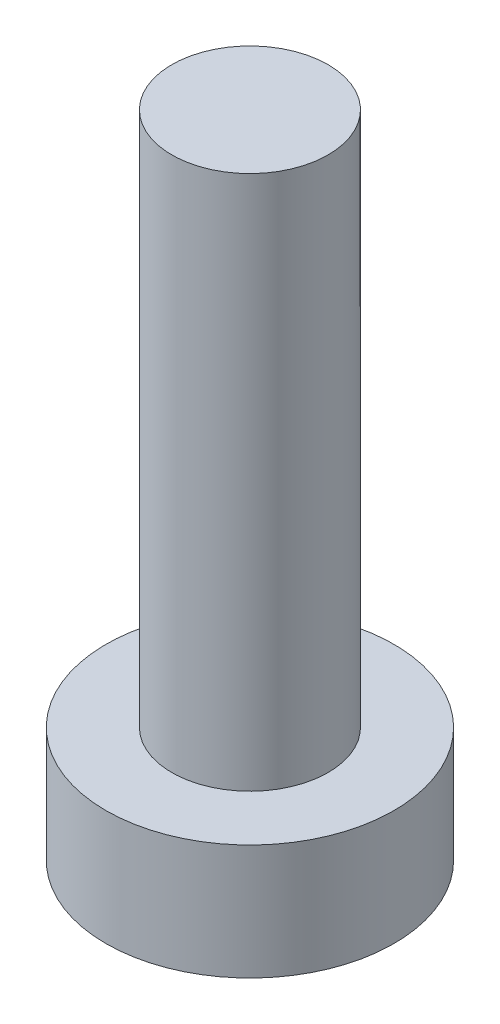
ISO-10303-21;
HEADER;
FILE_DESCRIPTION(('STEP AP214'),'2;1');
FILE_NAME('part.step','',(''),(''),'','','');
FILE_SCHEMA(('AUTOMOTIVE_DESIGN { 1 0 10303 214 1 1 1 1 }'));
ENDSEC;
DATA;
#1=APPLICATION_CONTEXT('core data for automotive mechanical design processes');
#2=APPLICATION_PROTOCOL_DEFINITION('international standard','automotive_design',2000,#1);
#3=PRODUCT_CONTEXT('',#1,'mechanical');
#4=PRODUCT('Part','Part','',(#3));
#5=PRODUCT_RELATED_PRODUCT_CATEGORY('part','',(#4));
#6=PRODUCT_DEFINITION_FORMATION('','',#4);
#7=PRODUCT_DEFINITION_CONTEXT('part definition',#1,'design');
#8=PRODUCT_DEFINITION('design','',#6,#7);
#9=PRODUCT_DEFINITION_SHAPE('','',#8);
#10=(LENGTH_UNIT() NAMED_UNIT(*) SI_UNIT(.MILLI.,.METRE.));
#11=(NAMED_UNIT(*) PLANE_ANGLE_UNIT() SI_UNIT($,.RADIAN.));
#12=(NAMED_UNIT(*) SI_UNIT($,.STERADIAN.) SOLID_ANGLE_UNIT());
#13=UNCERTAINTY_MEASURE_WITH_UNIT(LENGTH_MEASURE(1.E-05),#10,'distance_accuracy_value','');
#14=(GEOMETRIC_REPRESENTATION_CONTEXT(3) GLOBAL_UNCERTAINTY_ASSIGNED_CONTEXT((#13)) GLOBAL_UNIT_ASSIGNED_CONTEXT((#10,
#11,#12)) REPRESENTATION_CONTEXT('',''));
#15=CARTESIAN_POINT('',(0.,0.,0.));
#16=DIRECTION('',(0.,0.,1.));
#17=DIRECTION('',(1.,0.,0.));
#18=AXIS2_PLACEMENT_3D('',#15,#16,#17);
#19=CARTESIAN_POINT('',(0.,2.8,0.));
#20=DIRECTION('',(0.,-1.,0.));
#21=DIRECTION('',(0.,0.,-1.));
#22=AXIS2_PLACEMENT_3D('',#19,#20,#21);
#23=CYLINDRICAL_SURFACE('',#22,3.5);
#24=CARTESIAN_POINT('',(0.,2.8,0.));
#25=DIRECTION('',(0.,1.,0.));
#26=DIRECTION('',(0.,0.,1.));
#27=AXIS2_PLACEMENT_3D('',#24,#25,#26);
#28=CIRCLE('',#27,3.5);
#29=CARTESIAN_POINT('',(0.,2.8,3.5));
#30=VERTEX_POINT('',#29);
#31=EDGE_CURVE('E48',#30,#30,#28,.T.);
#32=ORIENTED_EDGE('',*,*,#31,.F.);
#33=EDGE_LOOP('',(#32));
#34=FACE_BOUND('',#33,.T.);
#35=CARTESIAN_POINT('',(0.,0.,0.));
#36=DIRECTION('',(0.,1.,0.));
#37=DIRECTION('',(0.,0.,1.));
#38=AXIS2_PLACEMENT_3D('',#35,#36,#37);
#39=CIRCLE('',#38,3.5);
#40=CARTESIAN_POINT('',(0.,0.,3.5));
#41=VERTEX_POINT('',#40);
#42=EDGE_CURVE('E42',#41,#41,#39,.T.);
#43=ORIENTED_EDGE('',*,*,#42,.T.);
#44=EDGE_LOOP('',(#43));
#45=FACE_BOUND('',#44,.T.);
#46=ADVANCED_FACE('F39',(#34,#45),#23,.T.);
#47=CARTESIAN_POINT('',(0.,2.8,0.));
#48=DIRECTION('',(0.,1.,0.));
#49=DIRECTION('',(0.,0.,1.));
#50=AXIS2_PLACEMENT_3D('',#47,#48,#49);
#51=PLANE('',#50);
#52=CARTESIAN_POINT('',(0.,2.8,0.));
#53=DIRECTION('',(0.,1.,0.));
#54=DIRECTION('',(0.,0.,1.));
#55=AXIS2_PLACEMENT_3D('',#52,#53,#54);
#56=CIRCLE('',#55,1.9);
#57=CARTESIAN_POINT('',(0.,2.8,-1.9));
#58=VERTEX_POINT('',#57);
#59=EDGE_CURVE('E11',#58,#58,#56,.T.);
#60=ORIENTED_EDGE('',*,*,#59,.F.);
#61=EDGE_LOOP('',(#60));
#62=FACE_BOUND('',#61,.T.);
#63=ORIENTED_EDGE('',*,*,#31,.T.);
#64=EDGE_LOOP('',(#63));
#65=FACE_BOUND('',#64,.T.);
#66=ADVANCED_FACE('F179',(#62,#65),#51,.T.);
#67=CARTESIAN_POINT('',(0.,0.,0.));
#68=DIRECTION('',(0.,1.,0.));
#69=DIRECTION('',(0.,0.,1.));
#70=AXIS2_PLACEMENT_3D('',#67,#68,#69);
#71=PLANE('',#70);
#72=DIRECTION('',(-0.5,0.,0.866025403784438));
#73=VECTOR('',#72,1.);
#74=CARTESIAN_POINT('',(1.44337567297406,0.,0.));
#75=LINE('',#74,#73);
#76=CARTESIAN_POINT('',(1.44337567297406,0.,0.));
#77=VERTEX_POINT('',#76);
#78=CARTESIAN_POINT('',(0.721687836487032,0.,1.25));
#79=VERTEX_POINT('',#78);
#80=EDGE_CURVE('E136',#77,#79,#75,.T.);
#81=ORIENTED_EDGE('',*,*,#80,.F.);
#82=DIRECTION('',(0.5,0.,0.866025403784439));
#83=VECTOR('',#82,1.);
#84=CARTESIAN_POINT('',(0.721687836487032,0.,-1.25));
#85=LINE('',#84,#83);
#86=CARTESIAN_POINT('',(0.721687836487032,0.,-1.25));
#87=VERTEX_POINT('',#86);
#88=EDGE_CURVE('E56',#87,#77,#85,.T.);
#89=ORIENTED_EDGE('',*,*,#88,.F.);
#90=DIRECTION('',(1.,0.,0.));
#91=VECTOR('',#90,1.);
#92=CARTESIAN_POINT('',(-0.721687836487032,0.,-1.25));
#93=LINE('',#92,#91);
#94=CARTESIAN_POINT('',(-0.721687836487032,0.,-1.25));
#95=VERTEX_POINT('',#94);
#96=EDGE_CURVE('E149',#95,#87,#93,.T.);
#97=ORIENTED_EDGE('',*,*,#96,.F.);
#98=DIRECTION('',(0.5,0.,-0.866025403784438));
#99=VECTOR('',#98,1.);
#100=CARTESIAN_POINT('',(-1.44337567297406,0.,0.));
#101=LINE('',#100,#99);
#102=CARTESIAN_POINT('',(-1.44337567297406,0.,0.));
#103=VERTEX_POINT('',#102);
#104=EDGE_CURVE('E146',#103,#95,#101,.T.);
#105=ORIENTED_EDGE('',*,*,#104,.F.);
#106=DIRECTION('',(-0.5,0.,-0.866025403784439));
#107=VECTOR('',#106,1.);
#108=CARTESIAN_POINT('',(-0.721687836487032,0.,1.25));
#109=LINE('',#108,#107);
#110=CARTESIAN_POINT('',(-0.721687836487032,0.,1.25));
#111=VERTEX_POINT('',#110);
#112=EDGE_CURVE('E104',#111,#103,#109,.T.);
#113=ORIENTED_EDGE('',*,*,#112,.F.);
#114=DIRECTION('',(-1.,0.,0.));
#115=VECTOR('',#114,1.);
#116=CARTESIAN_POINT('',(0.721687836487032,0.,1.25));
#117=LINE('',#116,#115);
#118=EDGE_CURVE('E140',#79,#111,#117,.T.);
#119=ORIENTED_EDGE('',*,*,#118,.F.);
#120=EDGE_LOOP('',(#81,#89,#97,#105,#113,#119));
#121=FACE_BOUND('',#120,.T.);
#122=ORIENTED_EDGE('',*,*,#42,.F.);
#123=EDGE_LOOP('',(#122));
#124=FACE_BOUND('',#123,.T.);
#125=ADVANCED_FACE('F176',(#121,#124),#71,.F.);
#126=CARTESIAN_POINT('',(0.,15.8,0.));
#127=DIRECTION('',(0.,-1.,0.));
#128=DIRECTION('',(0.,0.,-1.));
#129=AXIS2_PLACEMENT_3D('',#126,#127,#128);
#130=CYLINDRICAL_SURFACE('',#129,1.9);
#131=CARTESIAN_POINT('',(0.,15.8,0.));
#132=DIRECTION('',(0.,1.,0.));
#133=DIRECTION('',(0.,0.,1.));
#134=AXIS2_PLACEMENT_3D('',#131,#132,#133);
#135=CIRCLE('',#134,1.9);
#136=CARTESIAN_POINT('',(0.,15.8,-1.9));
#137=VERTEX_POINT('',#136);
#138=EDGE_CURVE('E155',#137,#137,#135,.T.);
#139=CARTESIAN_POINT('',(0.,15.8,-1.9));
#140=CARTESIAN_POINT('',(0.,15.6645833333333,-1.9));
#141=CARTESIAN_POINT('',(0.,15.5291666666667,-1.9));
#142=CARTESIAN_POINT('',(0.,15.2583333333333,-1.9));
#143=CARTESIAN_POINT('',(0.,15.1229166666667,-1.9));
#144=CARTESIAN_POINT('',(0.,14.8520833333333,-1.9));
#145=CARTESIAN_POINT('',(0.,14.7166666666667,-1.9));
#146=CARTESIAN_POINT('',(0.,14.4458333333333,-1.9));
#147=CARTESIAN_POINT('',(0.,14.3104166666667,-1.9));
#148=CARTESIAN_POINT('',(0.,14.0395833333333,-1.9));
#149=CARTESIAN_POINT('',(0.,13.9041666666667,-1.9));
#150=CARTESIAN_POINT('',(0.,13.6333333333333,-1.9));
#151=CARTESIAN_POINT('',(0.,13.4979166666667,-1.9));
#152=CARTESIAN_POINT('',(0.,13.2270833333333,-1.9));
#153=CARTESIAN_POINT('',(0.,13.0916666666667,-1.9));
#154=CARTESIAN_POINT('',(0.,12.8208333333333,-1.9));
#155=CARTESIAN_POINT('',(0.,12.6854166666667,-1.9));
#156=CARTESIAN_POINT('',(0.,12.4145833333333,-1.9));
#157=CARTESIAN_POINT('',(0.,12.2791666666667,-1.9));
#158=CARTESIAN_POINT('',(0.,12.0083333333333,-1.9));
#159=CARTESIAN_POINT('',(0.,11.8729166666667,-1.9));
#160=CARTESIAN_POINT('',(0.,11.6020833333333,-1.9));
#161=CARTESIAN_POINT('',(0.,11.4666666666667,-1.9));
#162=CARTESIAN_POINT('',(0.,11.1958333333333,-1.9));
#163=CARTESIAN_POINT('',(0.,11.0604166666667,-1.9));
#164=CARTESIAN_POINT('',(0.,10.7895833333333,-1.9));
#165=CARTESIAN_POINT('',(0.,10.6541666666667,-1.9));
#166=CARTESIAN_POINT('',(0.,10.3833333333333,-1.9));
#167=CARTESIAN_POINT('',(0.,10.2479166666667,-1.9));
#168=CARTESIAN_POINT('',(0.,9.97708333333333,-1.9));
#169=CARTESIAN_POINT('',(0.,9.84166666666666,-1.9));
#170=CARTESIAN_POINT('',(0.,9.57083333333333,-1.9));
#171=CARTESIAN_POINT('',(0.,9.43541666666667,-1.9));
#172=CARTESIAN_POINT('',(0.,9.16458333333333,-1.9));
#173=CARTESIAN_POINT('',(0.,9.02916666666667,-1.9));
#174=CARTESIAN_POINT('',(0.,8.75833333333333,-1.9));
#175=CARTESIAN_POINT('',(0.,8.62291666666667,-1.9));
#176=CARTESIAN_POINT('',(0.,8.35208333333333,-1.9));
#177=CARTESIAN_POINT('',(0.,8.21666666666667,-1.9));
#178=CARTESIAN_POINT('',(0.,7.94583333333333,-1.9));
#179=CARTESIAN_POINT('',(0.,7.81041666666666,-1.9));
#180=CARTESIAN_POINT('',(0.,7.53958333333333,-1.9));
#181=CARTESIAN_POINT('',(0.,7.40416666666667,-1.9));
#182=CARTESIAN_POINT('',(0.,7.13333333333333,-1.9));
#183=CARTESIAN_POINT('',(0.,6.99791666666667,-1.9));
#184=CARTESIAN_POINT('',(0.,6.72708333333333,-1.9));
#185=CARTESIAN_POINT('',(0.,6.59166666666667,-1.9));
#186=CARTESIAN_POINT('',(0.,6.32083333333333,-1.9));
#187=CARTESIAN_POINT('',(0.,6.18541666666667,-1.9));
#188=CARTESIAN_POINT('',(0.,5.91458333333333,-1.9));
#189=CARTESIAN_POINT('',(0.,5.77916666666666,-1.9));
#190=CARTESIAN_POINT('',(0.,5.50833333333333,-1.9));
#191=CARTESIAN_POINT('',(0.,5.37291666666667,-1.9));
#192=CARTESIAN_POINT('',(0.,5.10208333333333,-1.9));
#193=CARTESIAN_POINT('',(0.,4.96666666666667,-1.9));
#194=CARTESIAN_POINT('',(0.,4.69583333333333,-1.9));
#195=CARTESIAN_POINT('',(0.,4.56041666666667,-1.9));
#196=CARTESIAN_POINT('',(0.,4.28958333333333,-1.9));
#197=CARTESIAN_POINT('',(0.,4.15416666666666,-1.9));
#198=CARTESIAN_POINT('',(0.,3.88333333333333,-1.9));
#199=CARTESIAN_POINT('',(0.,3.74791666666667,-1.9));
#200=CARTESIAN_POINT('',(0.,3.47708333333333,-1.9));
#201=CARTESIAN_POINT('',(0.,3.34166666666667,-1.9));
#202=CARTESIAN_POINT('',(0.,3.07083333333333,-1.9));
#203=CARTESIAN_POINT('',(0.,2.93541666666667,-1.9));
#204=CARTESIAN_POINT('',(0.,2.8,-1.9));
#205=B_SPLINE_CURVE_WITH_KNOTS('',3,(#139,#140,#141,#142,#143,#144,#145,#146,#147,#148,#149,
#150,#151,#152,#153,#154,#155,#156,#157,#158,#159,#160,#161,#162,#163,#164,#165,#166,#167,#168,
#169,#170,#171,#172,#173,#174,#175,#176,#177,#178,#179,#180,#181,#182,#183,#184,#185,#186,#187,
#188,#189,#190,#191,#192,#193,#194,#195,#196,#197,#198,#199,#200,#201,#202,#203,#204),
.UNSPECIFIED.,.F.,.F.,(4,2,2,2,2,2,2,2,2,2,2,2,2,2,2,2,2,2,2,2,2,2,2,2,2,2,2,2,2,2,2,2,4),(0.,
0.406250000000002,0.812500000000001,1.21875,1.625,2.03125,2.4375,2.84375,3.25,3.65625,4.0625,
4.46875,4.875,5.28125,5.6875,6.09375,6.5,6.90625,7.3125,7.71875,8.125,8.53125,8.9375,9.34375,
9.75,10.15625,10.5625,10.96875,11.375,11.78125,12.1875,12.59375,13.),.UNSPECIFIED.);
#206=EDGE_CURVE('BSEAM178',#137,#58,#205,.T.);
#207=ORIENTED_EDGE('',*,*,#138,.F.);
#208=ORIENTED_EDGE('',*,*,#59,.T.);
#209=ORIENTED_EDGE('',*,*,#206,.T.);
#210=ORIENTED_EDGE('',*,*,#206,.F.);
#211=EDGE_LOOP('',(#207,#209,#208,#210));
#212=FACE_BOUND('',#211,.T.);
#213=ADVANCED_FACE('F178',(#212),#130,.T.);
#214=CARTESIAN_POINT('',(0.,15.8,0.));
#215=DIRECTION('',(0.,1.,0.));
#216=DIRECTION('',(0.,0.,1.));
#217=AXIS2_PLACEMENT_3D('',#214,#215,#216);
#218=PLANE('',#217);
#219=ORIENTED_EDGE('',*,*,#138,.T.);
#220=EDGE_LOOP('',(#219));
#221=FACE_BOUND('',#220,.T.);
#222=ADVANCED_FACE('F185',(#221),#218,.T.);
#223=CARTESIAN_POINT('',(0.721687836487032,2.3,-1.25));
#224=DIRECTION('',(0.866025403784439,0.,-0.5));
#225=DIRECTION('',(-0.5,0.,-0.866025403784439));
#226=AXIS2_PLACEMENT_3D('',#223,#224,#225);
#227=PLANE('',#226);
#228=ORIENTED_EDGE('',*,*,#88,.T.);
#229=DIRECTION('',(0.,-1.,0.));
#230=VECTOR('',#229,1.);
#231=CARTESIAN_POINT('',(1.44337567297406,2.3,0.));
#232=LINE('',#231,#230);
#233=CARTESIAN_POINT('',(1.44337567297406,2.3,0.));
#234=VERTEX_POINT('',#233);
#235=EDGE_CURVE('E86',#234,#77,#232,.T.);
#236=ORIENTED_EDGE('',*,*,#235,.F.);
#237=DIRECTION('',(0.5,0.,0.866025403784439));
#238=VECTOR('',#237,1.);
#239=CARTESIAN_POINT('',(0.721687836487032,2.3,-1.25));
#240=LINE('',#239,#238);
#241=CARTESIAN_POINT('',(0.721687836487032,2.3,-1.25));
#242=VERTEX_POINT('',#241);
#243=EDGE_CURVE('E152',#242,#234,#240,.T.);
#244=ORIENTED_EDGE('',*,*,#243,.F.);
#245=DIRECTION('',(0.,-1.,0.));
#246=VECTOR('',#245,1.);
#247=CARTESIAN_POINT('',(0.721687836487032,2.3,-1.25));
#248=LINE('',#247,#246);
#249=EDGE_CURVE('E64',#242,#87,#248,.T.);
#250=ORIENTED_EDGE('',*,*,#249,.T.);
#251=EDGE_LOOP('',(#228,#236,#244,#250));
#252=FACE_BOUND('',#251,.T.);
#253=ADVANCED_FACE('F214',(#252),#227,.F.);
#254=CARTESIAN_POINT('',(-0.721687836487032,2.3,-1.25));
#255=DIRECTION('',(0.,0.,-1.));
#256=DIRECTION('',(-1.,0.,0.));
#257=AXIS2_PLACEMENT_3D('',#254,#255,#256);
#258=PLANE('',#257);
#259=ORIENTED_EDGE('',*,*,#96,.T.);
#260=ORIENTED_EDGE('',*,*,#249,.F.);
#261=DIRECTION('',(1.,0.,0.));
#262=VECTOR('',#261,1.);
#263=CARTESIAN_POINT('',(-0.721687836487032,2.3,-1.25));
#264=LINE('',#263,#262);
#265=CARTESIAN_POINT('',(-0.721687836487032,2.3,-1.25));
#266=VERTEX_POINT('',#265);
#267=EDGE_CURVE('E118',#266,#242,#264,.T.);
#268=ORIENTED_EDGE('',*,*,#267,.F.);
#269=DIRECTION('',(0.,-1.,0.));
#270=VECTOR('',#269,1.);
#271=CARTESIAN_POINT('',(-0.721687836487032,2.3,-1.25));
#272=LINE('',#271,#270);
#273=EDGE_CURVE('E109',#266,#95,#272,.T.);
#274=ORIENTED_EDGE('',*,*,#273,.T.);
#275=EDGE_LOOP('',(#259,#260,#268,#274));
#276=FACE_BOUND('',#275,.T.);
#277=ADVANCED_FACE('F228',(#276),#258,.F.);
#278=CARTESIAN_POINT('',(-1.44337567297406,2.3,0.));
#279=DIRECTION('',(-0.866025403784438,0.,-0.5));
#280=DIRECTION('',(-0.5,0.,0.866025403784438));
#281=AXIS2_PLACEMENT_3D('',#278,#279,#280);
#282=PLANE('',#281);
#283=ORIENTED_EDGE('',*,*,#104,.T.);
#284=ORIENTED_EDGE('',*,*,#273,.F.);
#285=DIRECTION('',(0.5,0.,-0.866025403784438));
#286=VECTOR('',#285,1.);
#287=CARTESIAN_POINT('',(-1.44337567297406,2.3,0.));
#288=LINE('',#287,#286);
#289=CARTESIAN_POINT('',(-1.44337567297406,2.3,0.));
#290=VERTEX_POINT('',#289);
#291=EDGE_CURVE('E113',#290,#266,#288,.T.);
#292=ORIENTED_EDGE('',*,*,#291,.F.);
#293=DIRECTION('',(0.,-1.,0.));
#294=VECTOR('',#293,1.);
#295=CARTESIAN_POINT('',(-1.44337567297406,2.3,0.));
#296=LINE('',#295,#294);
#297=EDGE_CURVE('E97',#290,#103,#296,.T.);
#298=ORIENTED_EDGE('',*,*,#297,.T.);
#299=EDGE_LOOP('',(#283,#284,#292,#298));
#300=FACE_BOUND('',#299,.T.);
#301=ADVANCED_FACE('F114',(#300),#282,.F.);
#302=CARTESIAN_POINT('',(-0.721687836487032,2.3,1.25));
#303=DIRECTION('',(-0.866025403784439,0.,0.5));
#304=DIRECTION('',(0.5,0.,0.866025403784438));
#305=AXIS2_PLACEMENT_3D('',#302,#303,#304);
#306=PLANE('',#305);
#307=ORIENTED_EDGE('',*,*,#112,.T.);
#308=ORIENTED_EDGE('',*,*,#297,.F.);
#309=DIRECTION('',(-0.5,0.,-0.866025403784439));
#310=VECTOR('',#309,1.);
#311=CARTESIAN_POINT('',(-0.721687836487032,2.3,1.25));
#312=LINE('',#311,#310);
#313=CARTESIAN_POINT('',(-0.721687836487032,2.3,1.25));
#314=VERTEX_POINT('',#313);
#315=EDGE_CURVE('E101',#314,#290,#312,.T.);
#316=ORIENTED_EDGE('',*,*,#315,.F.);
#317=DIRECTION('',(0.,-1.,0.));
#318=VECTOR('',#317,1.);
#319=CARTESIAN_POINT('',(-0.721687836487032,2.3,1.25));
#320=LINE('',#319,#318);
#321=EDGE_CURVE('E110',#314,#111,#320,.T.);
#322=ORIENTED_EDGE('',*,*,#321,.T.);
#323=EDGE_LOOP('',(#307,#308,#316,#322));
#324=FACE_BOUND('',#323,.T.);
#325=ADVANCED_FACE('F99',(#324),#306,.F.);
#326=CARTESIAN_POINT('',(0.721687836487032,2.3,1.25));
#327=DIRECTION('',(0.,0.,1.));
#328=DIRECTION('',(1.,0.,0.));
#329=AXIS2_PLACEMENT_3D('',#326,#327,#328);
#330=PLANE('',#329);
#331=ORIENTED_EDGE('',*,*,#118,.T.);
#332=ORIENTED_EDGE('',*,*,#321,.F.);
#333=DIRECTION('',(-1.,0.,0.));
#334=VECTOR('',#333,1.);
#335=CARTESIAN_POINT('',(0.721687836487032,2.3,1.25));
#336=LINE('',#335,#334);
#337=CARTESIAN_POINT('',(0.721687836487032,2.3,1.25));
#338=VERTEX_POINT('',#337);
#339=EDGE_CURVE('E124',#338,#314,#336,.T.);
#340=ORIENTED_EDGE('',*,*,#339,.F.);
#341=DIRECTION('',(0.,-1.,0.));
#342=VECTOR('',#341,1.);
#343=CARTESIAN_POINT('',(0.721687836487032,2.3,1.25));
#344=LINE('',#343,#342);
#345=EDGE_CURVE('E160',#338,#79,#344,.T.);
#346=ORIENTED_EDGE('',*,*,#345,.T.);
#347=EDGE_LOOP('',(#331,#332,#340,#346));
#348=FACE_BOUND('',#347,.T.);
#349=ADVANCED_FACE('F253',(#348),#330,.F.);
#350=CARTESIAN_POINT('',(1.44337567297406,2.3,0.));
#351=DIRECTION('',(0.866025403784438,0.,0.5));
#352=DIRECTION('',(0.5,0.,-0.866025403784438));
#353=AXIS2_PLACEMENT_3D('',#350,#351,#352);
#354=PLANE('',#353);
#355=ORIENTED_EDGE('',*,*,#80,.T.);
#356=ORIENTED_EDGE('',*,*,#345,.F.);
#357=DIRECTION('',(-0.5,0.,0.866025403784438));
#358=VECTOR('',#357,1.);
#359=CARTESIAN_POINT('',(1.44337567297406,2.3,0.));
#360=LINE('',#359,#358);
#361=EDGE_CURVE('E128',#234,#338,#360,.T.);
#362=ORIENTED_EDGE('',*,*,#361,.F.);
#363=ORIENTED_EDGE('',*,*,#235,.T.);
#364=EDGE_LOOP('',(#355,#356,#362,#363));
#365=FACE_BOUND('',#364,.T.);
#366=ADVANCED_FACE('F262',(#365),#354,.F.);
#367=CARTESIAN_POINT('',(0.,2.3,0.));
#368=DIRECTION('',(0.,-1.,0.));
#369=DIRECTION('',(0.,0.,-1.));
#370=AXIS2_PLACEMENT_3D('',#367,#368,#369);
#371=PLANE('',#370);
#372=ORIENTED_EDGE('',*,*,#243,.T.);
#373=ORIENTED_EDGE('',*,*,#361,.T.);
#374=ORIENTED_EDGE('',*,*,#339,.T.);
#375=ORIENTED_EDGE('',*,*,#315,.T.);
#376=ORIENTED_EDGE('',*,*,#291,.T.);
#377=ORIENTED_EDGE('',*,*,#267,.T.);
#378=EDGE_LOOP('',(#372,#373,#374,#375,#376,#377));
#379=FACE_BOUND('',#378,.T.);
#380=ADVANCED_FACE('F121',(#379),#371,.T.);
#381=CLOSED_SHELL('',(#46,#66,#125,#213,#222,#253,#277,#301,#325,#349,#366,#380));
#382=MANIFOLD_SOLID_BREP('B2',#381);
#383=ADVANCED_BREP_SHAPE_REPRESENTATION('',(#18,#382),#14);
#384=SHAPE_DEFINITION_REPRESENTATION(#9,#383);
ENDSEC;
END-ISO-10303-21;
